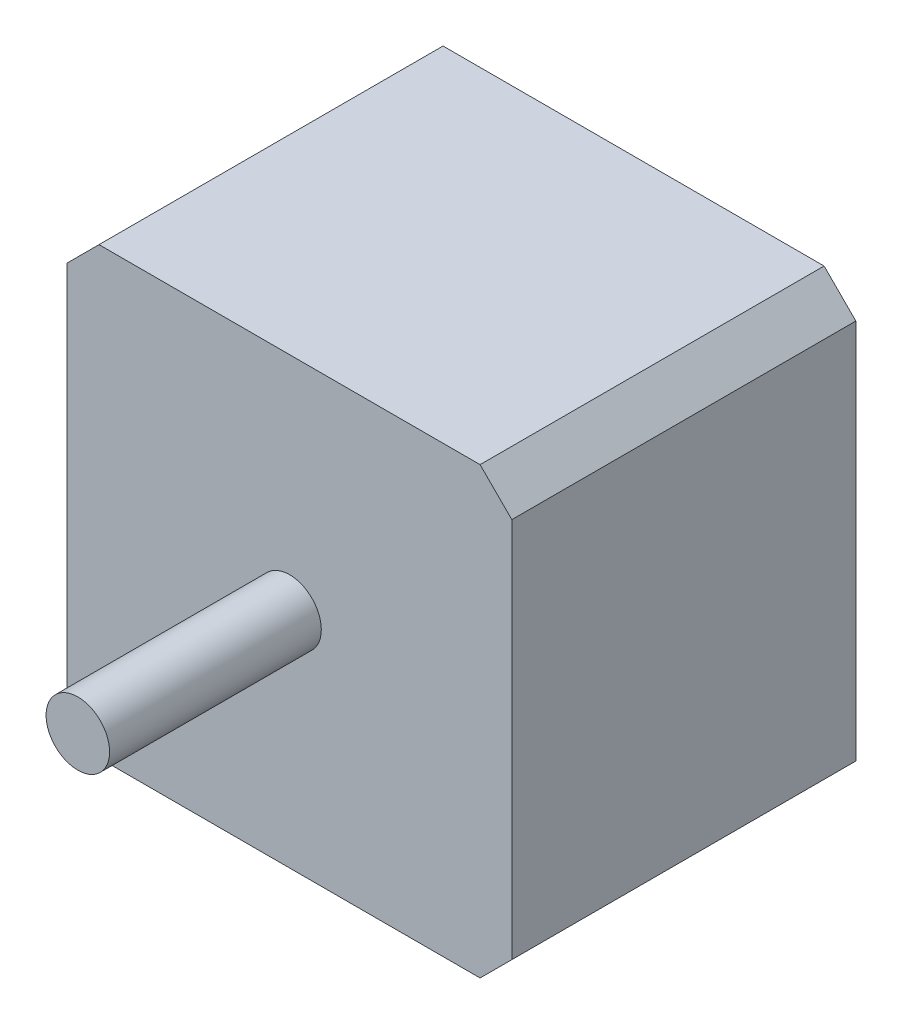
ISO-10303-21;
HEADER;
FILE_DESCRIPTION(('STEP AP214'),'2;1');
FILE_NAME('part.step','',(''),(''),'','','');
FILE_SCHEMA(('AUTOMOTIVE_DESIGN { 1 0 10303 214 1 1 1 1 }'));
ENDSEC;
DATA;
#1=APPLICATION_CONTEXT('core data for automotive mechanical design processes');
#2=APPLICATION_PROTOCOL_DEFINITION('international standard','automotive_design',2000,#1);
#3=PRODUCT_CONTEXT('',#1,'mechanical');
#4=PRODUCT('Part','Part','',(#3));
#5=PRODUCT_RELATED_PRODUCT_CATEGORY('part','',(#4));
#6=PRODUCT_DEFINITION_FORMATION('','',#4);
#7=PRODUCT_DEFINITION_CONTEXT('part definition',#1,'design');
#8=PRODUCT_DEFINITION('design','',#6,#7);
#9=PRODUCT_DEFINITION_SHAPE('','',#8);
#10=(LENGTH_UNIT() NAMED_UNIT(*) SI_UNIT(.MILLI.,.METRE.));
#11=(NAMED_UNIT(*) PLANE_ANGLE_UNIT() SI_UNIT($,.RADIAN.));
#12=(NAMED_UNIT(*) SI_UNIT($,.STERADIAN.) SOLID_ANGLE_UNIT());
#13=UNCERTAINTY_MEASURE_WITH_UNIT(LENGTH_MEASURE(1.E-05),#10,'distance_accuracy_value','');
#14=(GEOMETRIC_REPRESENTATION_CONTEXT(3) GLOBAL_UNCERTAINTY_ASSIGNED_CONTEXT((#13)) GLOBAL_UNIT_ASSIGNED_CONTEXT((#10,
#11,#12)) REPRESENTATION_CONTEXT('',''));
#15=CARTESIAN_POINT('',(0.,0.,0.));
#16=DIRECTION('',(0.,0.,1.));
#17=DIRECTION('',(1.,0.,0.));
#18=AXIS2_PLACEMENT_3D('',#15,#16,#17);
#19=CARTESIAN_POINT('',(-21.,21.,32.5));
#20=DIRECTION('',(0.,-1.,0.));
#21=DIRECTION('',(1.,0.,0.));
#22=AXIS2_PLACEMENT_3D('',#19,#20,#21);
#23=PLANE('',#22);
#24=DIRECTION('',(-1.,0.,0.));
#25=VECTOR('',#24,1.);
#26=CARTESIAN_POINT('',(-21.,21.,0.));
#27=LINE('',#26,#25);
#28=CARTESIAN_POINT('',(18.,21.,0.));
#29=VERTEX_POINT('',#28);
#30=CARTESIAN_POINT('',(-18.,21.,0.));
#31=VERTEX_POINT('',#30);
#32=EDGE_CURVE('E137',#29,#31,#27,.T.);
#33=ORIENTED_EDGE('',*,*,#32,.T.);
#34=DIRECTION('',(0.,0.,1.));
#35=VECTOR('',#34,1.);
#36=CARTESIAN_POINT('',(-18.,21.,32.5));
#37=LINE('',#36,#35);
#38=CARTESIAN_POINT('',(-18.,21.,32.5));
#39=VERTEX_POINT('',#38);
#40=EDGE_CURVE('E115',#31,#39,#37,.T.);
#41=ORIENTED_EDGE('',*,*,#40,.T.);
#42=DIRECTION('',(-1.,0.,0.));
#43=VECTOR('',#42,1.);
#44=CARTESIAN_POINT('',(-21.,21.,32.5));
#45=LINE('',#44,#43);
#46=CARTESIAN_POINT('',(18.,21.,32.5));
#47=VERTEX_POINT('',#46);
#48=EDGE_CURVE('E147',#47,#39,#45,.T.);
#49=ORIENTED_EDGE('',*,*,#48,.F.);
#50=DIRECTION('',(0.,0.,-1.));
#51=VECTOR('',#50,1.);
#52=CARTESIAN_POINT('',(18.,21.,32.5));
#53=LINE('',#52,#51);
#54=EDGE_CURVE('E120',#47,#29,#53,.T.);
#55=ORIENTED_EDGE('',*,*,#54,.T.);
#56=EDGE_LOOP('',(#33,#41,#49,#55));
#57=FACE_BOUND('',#56,.T.);
#58=ADVANCED_FACE('F43',(#57),#23,.F.);
#59=CARTESIAN_POINT('',(-21.,-21.,32.5));
#60=DIRECTION('',(1.,0.,0.));
#61=DIRECTION('',(0.,1.,0.));
#62=AXIS2_PLACEMENT_3D('',#59,#60,#61);
#63=PLANE('',#62);
#64=DIRECTION('',(0.,-1.,0.));
#65=VECTOR('',#64,1.);
#66=CARTESIAN_POINT('',(-21.,-21.,32.5));
#67=LINE('',#66,#65);
#68=CARTESIAN_POINT('',(-21.,18.,32.5));
#69=VERTEX_POINT('',#68);
#70=CARTESIAN_POINT('',(-21.,-18.,32.5));
#71=VERTEX_POINT('',#70);
#72=EDGE_CURVE('E130',#69,#71,#67,.T.);
#73=ORIENTED_EDGE('',*,*,#72,.F.);
#74=DIRECTION('',(0.,0.,-1.));
#75=VECTOR('',#74,1.);
#76=CARTESIAN_POINT('',(-21.,18.,32.5));
#77=LINE('',#76,#75);
#78=CARTESIAN_POINT('',(-21.,18.,0.));
#79=VERTEX_POINT('',#78);
#80=EDGE_CURVE('E114',#69,#79,#77,.T.);
#81=ORIENTED_EDGE('',*,*,#80,.T.);
#82=DIRECTION('',(0.,-1.,0.));
#83=VECTOR('',#82,1.);
#84=CARTESIAN_POINT('',(-21.,-21.,0.));
#85=LINE('',#84,#83);
#86=CARTESIAN_POINT('',(-21.,-18.,0.));
#87=VERTEX_POINT('',#86);
#88=EDGE_CURVE('E127',#79,#87,#85,.T.);
#89=ORIENTED_EDGE('',*,*,#88,.T.);
#90=DIRECTION('',(0.,0.,1.));
#91=VECTOR('',#90,1.);
#92=CARTESIAN_POINT('',(-21.,-18.,32.5));
#93=LINE('',#92,#91);
#94=EDGE_CURVE('E132',#87,#71,#93,.T.);
#95=ORIENTED_EDGE('',*,*,#94,.T.);
#96=EDGE_LOOP('',(#73,#81,#89,#95));
#97=FACE_BOUND('',#96,.T.);
#98=ADVANCED_FACE('F126',(#97),#63,.F.);
#99=CARTESIAN_POINT('',(-21.,-21.,32.5));
#100=DIRECTION('',(0.,1.,0.));
#101=DIRECTION('',(-1.,0.,0.));
#102=AXIS2_PLACEMENT_3D('',#99,#100,#101);
#103=PLANE('',#102);
#104=DIRECTION('',(1.,0.,0.));
#105=VECTOR('',#104,1.);
#106=CARTESIAN_POINT('',(-21.,-21.,32.5));
#107=LINE('',#106,#105);
#108=CARTESIAN_POINT('',(-18.,-21.,32.5));
#109=VERTEX_POINT('',#108);
#110=CARTESIAN_POINT('',(18.,-21.,32.5));
#111=VERTEX_POINT('',#110);
#112=EDGE_CURVE('E173',#109,#111,#107,.T.);
#113=ORIENTED_EDGE('',*,*,#112,.F.);
#114=DIRECTION('',(0.,0.,-1.));
#115=VECTOR('',#114,1.);
#116=CARTESIAN_POINT('',(-18.,-21.,32.5));
#117=LINE('',#116,#115);
#118=CARTESIAN_POINT('',(-18.,-21.,0.));
#119=VERTEX_POINT('',#118);
#120=EDGE_CURVE('E166',#109,#119,#117,.T.);
#121=ORIENTED_EDGE('',*,*,#120,.T.);
#122=DIRECTION('',(1.,0.,0.));
#123=VECTOR('',#122,1.);
#124=CARTESIAN_POINT('',(-21.,-21.,0.));
#125=LINE('',#124,#123);
#126=CARTESIAN_POINT('',(18.,-21.,0.));
#127=VERTEX_POINT('',#126);
#128=EDGE_CURVE('E136',#119,#127,#125,.T.);
#129=ORIENTED_EDGE('',*,*,#128,.T.);
#130=DIRECTION('',(0.,0.,1.));
#131=VECTOR('',#130,1.);
#132=CARTESIAN_POINT('',(18.,-21.,32.5));
#133=LINE('',#132,#131);
#134=EDGE_CURVE('E164',#127,#111,#133,.T.);
#135=ORIENTED_EDGE('',*,*,#134,.T.);
#136=EDGE_LOOP('',(#113,#121,#129,#135));
#137=FACE_BOUND('',#136,.T.);
#138=ADVANCED_FACE('F171',(#137),#103,.F.);
#139=CARTESIAN_POINT('',(21.,-21.,32.5));
#140=DIRECTION('',(-1.,0.,0.));
#141=DIRECTION('',(0.,0.,1.));
#142=AXIS2_PLACEMENT_3D('',#139,#140,#141);
#143=PLANE('',#142);
#144=DIRECTION('',(0.,1.,0.));
#145=VECTOR('',#144,1.);
#146=CARTESIAN_POINT('',(21.,-21.,32.5));
#147=LINE('',#146,#145);
#148=CARTESIAN_POINT('',(21.,-18.,32.5));
#149=VERTEX_POINT('',#148);
#150=CARTESIAN_POINT('',(21.,18.,32.5));
#151=VERTEX_POINT('',#150);
#152=EDGE_CURVE('E148',#149,#151,#147,.T.);
#153=ORIENTED_EDGE('',*,*,#152,.F.);
#154=DIRECTION('',(0.,0.,-1.));
#155=VECTOR('',#154,1.);
#156=CARTESIAN_POINT('',(21.,-18.,32.5));
#157=LINE('',#156,#155);
#158=CARTESIAN_POINT('',(21.,-18.,0.));
#159=VERTEX_POINT('',#158);
#160=EDGE_CURVE('E11',#149,#159,#157,.T.);
#161=ORIENTED_EDGE('',*,*,#160,.T.);
#162=DIRECTION('',(0.,1.,0.));
#163=VECTOR('',#162,1.);
#164=CARTESIAN_POINT('',(21.,-21.,0.));
#165=LINE('',#164,#163);
#166=CARTESIAN_POINT('',(21.,18.,0.));
#167=VERTEX_POINT('',#166);
#168=EDGE_CURVE('E140',#159,#167,#165,.T.);
#169=ORIENTED_EDGE('',*,*,#168,.T.);
#170=DIRECTION('',(0.,0.,1.));
#171=VECTOR('',#170,1.);
#172=CARTESIAN_POINT('',(21.,18.,32.5));
#173=LINE('',#172,#171);
#174=EDGE_CURVE('E52',#167,#151,#173,.T.);
#175=ORIENTED_EDGE('',*,*,#174,.T.);
#176=EDGE_LOOP('',(#153,#161,#169,#175));
#177=FACE_BOUND('',#176,.T.);
#178=ADVANCED_FACE('F180',(#177),#143,.F.);
#179=CARTESIAN_POINT('',(0.,0.,32.5));
#180=DIRECTION('',(0.,0.,1.));
#181=DIRECTION('',(1.,0.,0.));
#182=AXIS2_PLACEMENT_3D('',#179,#180,#181);
#183=PLANE('',#182);
#184=CARTESIAN_POINT('',(0.,0.,32.5));
#185=DIRECTION('',(0.,0.,1.));
#186=DIRECTION('',(1.,0.,0.));
#187=AXIS2_PLACEMENT_3D('',#184,#185,#186);
#188=CIRCLE('',#187,3.);
#189=CARTESIAN_POINT('',(3.,0.,32.5));
#190=VERTEX_POINT('',#189);
#191=EDGE_CURVE('E187',#190,#190,#188,.T.);
#192=ORIENTED_EDGE('',*,*,#191,.F.);
#193=EDGE_LOOP('',(#192));
#194=FACE_BOUND('',#193,.T.);
#195=ORIENTED_EDGE('',*,*,#48,.T.);
#196=DIRECTION('',(0.707106781186548,0.707106781186547,0.));
#197=VECTOR('',#196,1.);
#198=CARTESIAN_POINT('',(-19.5,19.5,32.5));
#199=LINE('',#198,#197);
#200=EDGE_CURVE('E162',#39,#69,#199,.F.);
#201=ORIENTED_EDGE('',*,*,#200,.T.);
#202=ORIENTED_EDGE('',*,*,#72,.T.);
#203=DIRECTION('',(-0.707106781186547,0.707106781186548,0.));
#204=VECTOR('',#203,1.);
#205=CARTESIAN_POINT('',(-19.5,-19.5,32.5));
#206=LINE('',#205,#204);
#207=EDGE_CURVE('E160',#71,#109,#206,.F.);
#208=ORIENTED_EDGE('',*,*,#207,.T.);
#209=ORIENTED_EDGE('',*,*,#112,.T.);
#210=DIRECTION('',(-0.707106781186549,-0.707106781186546,0.));
#211=VECTOR('',#210,1.);
#212=CARTESIAN_POINT('',(19.5,-19.5,32.5));
#213=LINE('',#212,#211);
#214=EDGE_CURVE('E65',#111,#149,#213,.F.);
#215=ORIENTED_EDGE('',*,*,#214,.T.);
#216=ORIENTED_EDGE('',*,*,#152,.T.);
#217=DIRECTION('',(0.707106781186547,-0.707106781186548,0.));
#218=VECTOR('',#217,1.);
#219=CARTESIAN_POINT('',(19.5,19.5,32.5));
#220=LINE('',#219,#218);
#221=EDGE_CURVE('E157',#151,#47,#220,.F.);
#222=ORIENTED_EDGE('',*,*,#221,.T.);
#223=EDGE_LOOP('',(#195,#201,#202,#208,#209,#215,#216,#222));
#224=FACE_BOUND('',#223,.T.);
#225=ADVANCED_FACE('F201',(#194,#224),#183,.T.);
#226=CARTESIAN_POINT('',(0.,0.,0.));
#227=DIRECTION('',(0.,0.,1.));
#228=DIRECTION('',(1.,0.,0.));
#229=AXIS2_PLACEMENT_3D('',#226,#227,#228);
#230=PLANE('',#229);
#231=ORIENTED_EDGE('',*,*,#88,.F.);
#232=DIRECTION('',(-0.707106781186548,-0.707106781186547,0.));
#233=VECTOR('',#232,1.);
#234=CARTESIAN_POINT('',(-21.,18.,0.));
#235=LINE('',#234,#233);
#236=EDGE_CURVE('E110',#79,#31,#235,.F.);
#237=ORIENTED_EDGE('',*,*,#236,.T.);
#238=ORIENTED_EDGE('',*,*,#32,.F.);
#239=DIRECTION('',(-0.707106781186547,0.707106781186548,0.));
#240=VECTOR('',#239,1.);
#241=CARTESIAN_POINT('',(18.,21.,0.));
#242=LINE('',#241,#240);
#243=EDGE_CURVE('E131',#29,#167,#242,.F.);
#244=ORIENTED_EDGE('',*,*,#243,.T.);
#245=ORIENTED_EDGE('',*,*,#168,.F.);
#246=DIRECTION('',(0.707106781186549,0.707106781186546,0.));
#247=VECTOR('',#246,1.);
#248=CARTESIAN_POINT('',(21.,-18.,0.));
#249=LINE('',#248,#247);
#250=EDGE_CURVE('E151',#159,#127,#249,.F.);
#251=ORIENTED_EDGE('',*,*,#250,.T.);
#252=ORIENTED_EDGE('',*,*,#128,.F.);
#253=DIRECTION('',(0.707106781186547,-0.707106781186548,0.));
#254=VECTOR('',#253,1.);
#255=CARTESIAN_POINT('',(-18.,-21.,0.));
#256=LINE('',#255,#254);
#257=EDGE_CURVE('E121',#119,#87,#256,.F.);
#258=ORIENTED_EDGE('',*,*,#257,.T.);
#259=EDGE_LOOP('',(#231,#237,#238,#244,#245,#251,#252,#258));
#260=FACE_BOUND('',#259,.T.);
#261=ADVANCED_FACE('F134',(#260),#230,.F.);
#262=CARTESIAN_POINT('',(-21.,18.,32.5));
#263=DIRECTION('',(0.707106781186547,-0.707106781186548,0.));
#264=DIRECTION('',(0.,0.,-1.));
#265=AXIS2_PLACEMENT_3D('',#262,#263,#264);
#266=PLANE('',#265);
#267=ORIENTED_EDGE('',*,*,#200,.F.);
#268=ORIENTED_EDGE('',*,*,#40,.F.);
#269=ORIENTED_EDGE('',*,*,#236,.F.);
#270=ORIENTED_EDGE('',*,*,#80,.F.);
#271=EDGE_LOOP('',(#267,#268,#269,#270));
#272=FACE_BOUND('',#271,.T.);
#273=ADVANCED_FACE('F113',(#272),#266,.F.);
#274=CARTESIAN_POINT('',(-18.,-21.,32.5));
#275=DIRECTION('',(0.707106781186548,0.707106781186547,0.));
#276=DIRECTION('',(0.,0.,-1.));
#277=AXIS2_PLACEMENT_3D('',#274,#275,#276);
#278=PLANE('',#277);
#279=ORIENTED_EDGE('',*,*,#207,.F.);
#280=ORIENTED_EDGE('',*,*,#94,.F.);
#281=ORIENTED_EDGE('',*,*,#257,.F.);
#282=ORIENTED_EDGE('',*,*,#120,.F.);
#283=EDGE_LOOP('',(#279,#280,#281,#282));
#284=FACE_BOUND('',#283,.T.);
#285=ADVANCED_FACE('F212',(#284),#278,.F.);
#286=CARTESIAN_POINT('',(21.,-18.,32.5));
#287=DIRECTION('',(-0.707106781186546,0.707106781186549,0.));
#288=DIRECTION('',(0.,0.,-1.));
#289=AXIS2_PLACEMENT_3D('',#286,#287,#288);
#290=PLANE('',#289);
#291=ORIENTED_EDGE('',*,*,#214,.F.);
#292=ORIENTED_EDGE('',*,*,#134,.F.);
#293=ORIENTED_EDGE('',*,*,#250,.F.);
#294=ORIENTED_EDGE('',*,*,#160,.F.);
#295=EDGE_LOOP('',(#291,#292,#293,#294));
#296=FACE_BOUND('',#295,.T.);
#297=ADVANCED_FACE('F179',(#296),#290,.F.);
#298=CARTESIAN_POINT('',(18.,21.,32.5));
#299=DIRECTION('',(-0.707106781186548,-0.707106781186547,0.));
#300=DIRECTION('',(0.,0.,-1.));
#301=AXIS2_PLACEMENT_3D('',#298,#299,#300);
#302=PLANE('',#301);
#303=ORIENTED_EDGE('',*,*,#221,.F.);
#304=ORIENTED_EDGE('',*,*,#174,.F.);
#305=ORIENTED_EDGE('',*,*,#243,.F.);
#306=ORIENTED_EDGE('',*,*,#54,.F.);
#307=EDGE_LOOP('',(#303,#304,#305,#306));
#308=FACE_BOUND('',#307,.T.);
#309=ADVANCED_FACE('F46',(#308),#302,.F.);
#310=CARTESIAN_POINT('',(0.,0.,52.5));
#311=DIRECTION('',(0.,0.,-1.));
#312=DIRECTION('',(-1.,0.,0.));
#313=AXIS2_PLACEMENT_3D('',#310,#311,#312);
#314=CYLINDRICAL_SURFACE('',#313,3.);
#315=CARTESIAN_POINT('',(0.,0.,52.5));
#316=DIRECTION('',(0.,0.,1.));
#317=DIRECTION('',(1.,0.,0.));
#318=AXIS2_PLACEMENT_3D('',#315,#316,#317);
#319=CIRCLE('',#318,3.);
#320=CARTESIAN_POINT('',(3.,0.,52.5));
#321=VERTEX_POINT('',#320);
#322=EDGE_CURVE('E142',#321,#321,#319,.T.);
#323=ORIENTED_EDGE('',*,*,#322,.F.);
#324=EDGE_LOOP('',(#323));
#325=FACE_BOUND('',#324,.T.);
#326=ORIENTED_EDGE('',*,*,#191,.T.);
#327=EDGE_LOOP('',(#326));
#328=FACE_BOUND('',#327,.T.);
#329=ADVANCED_FACE('F195',(#325,#328),#314,.T.);
#330=CARTESIAN_POINT('',(0.,0.,52.5));
#331=DIRECTION('',(0.,0.,1.));
#332=DIRECTION('',(1.,0.,0.));
#333=AXIS2_PLACEMENT_3D('',#330,#331,#332);
#334=PLANE('',#333);
#335=ORIENTED_EDGE('',*,*,#322,.T.);
#336=EDGE_LOOP('',(#335));
#337=FACE_BOUND('',#336,.T.);
#338=ADVANCED_FACE('F193',(#337),#334,.T.);
#339=CLOSED_SHELL('',(#58,#98,#138,#178,#225,#261,#273,#285,#297,#309,#329,#338));
#340=MANIFOLD_SOLID_BREP('B2',#339);
#341=ADVANCED_BREP_SHAPE_REPRESENTATION('',(#18,#340),#14);
#342=SHAPE_DEFINITION_REPRESENTATION(#9,#341);
ENDSEC;
END-ISO-10303-21;
